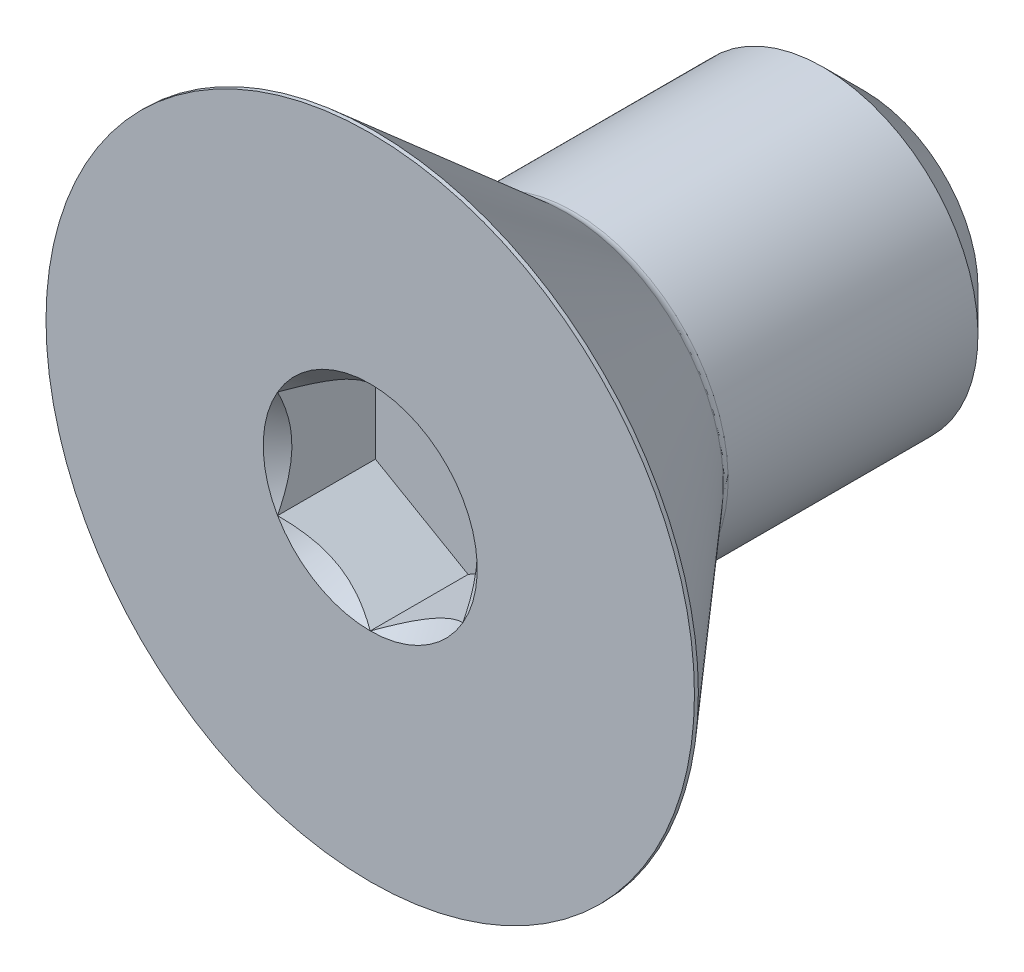
ISO-10303-21;
HEADER;
FILE_DESCRIPTION(('STEP AP214'),'2;1');
FILE_NAME('part.step','',(''),(''),'','','');
FILE_SCHEMA(('AUTOMOTIVE_DESIGN { 1 0 10303 214 1 1 1 1 }'));
ENDSEC;
DATA;
#1=APPLICATION_CONTEXT('core data for automotive mechanical design processes');
#2=APPLICATION_PROTOCOL_DEFINITION('international standard','automotive_design',2000,#1);
#3=PRODUCT_CONTEXT('',#1,'mechanical');
#4=PRODUCT('Part','Part','',(#3));
#5=PRODUCT_RELATED_PRODUCT_CATEGORY('part','',(#4));
#6=PRODUCT_DEFINITION_FORMATION('','',#4);
#7=PRODUCT_DEFINITION_CONTEXT('part definition',#1,'design');
#8=PRODUCT_DEFINITION('design','',#6,#7);
#9=PRODUCT_DEFINITION_SHAPE('','',#8);
#10=(LENGTH_UNIT() NAMED_UNIT(*) SI_UNIT(.MILLI.,.METRE.));
#11=(NAMED_UNIT(*) PLANE_ANGLE_UNIT() SI_UNIT($,.RADIAN.));
#12=(NAMED_UNIT(*) SI_UNIT($,.STERADIAN.) SOLID_ANGLE_UNIT());
#13=UNCERTAINTY_MEASURE_WITH_UNIT(LENGTH_MEASURE(1.E-05),#10,'distance_accuracy_value','');
#14=(GEOMETRIC_REPRESENTATION_CONTEXT(3) GLOBAL_UNCERTAINTY_ASSIGNED_CONTEXT((#13)) GLOBAL_UNIT_ASSIGNED_CONTEXT((#10,
#11,#12)) REPRESENTATION_CONTEXT('',''));
#15=CARTESIAN_POINT('',(0.,0.,0.));
#16=DIRECTION('',(0.,0.,1.));
#17=DIRECTION('',(1.,0.,0.));
#18=AXIS2_PLACEMENT_3D('',#15,#16,#17);
#19=CARTESIAN_POINT('',(0.,0.,6.35));
#20=DIRECTION('',(0.,0.,1.));
#21=DIRECTION('',(1.,0.,0.));
#22=AXIS2_PLACEMENT_3D('',#19,#20,#21);
#23=CONICAL_SURFACE('',#22,2.74963065701559,0.78539816339745);
#24=CARTESIAN_POINT('',(0.,0.,6.35));
#25=DIRECTION('',(0.,0.,1.));
#26=DIRECTION('',(1.,0.,0.));
#27=AXIS2_PLACEMENT_3D('',#24,#25,#26);
#28=CIRCLE('',#27,2.74963065701559);
#29=CARTESIAN_POINT('',(0.,-2.74963065701559,6.35));
#30=VERTEX_POINT('',#29);
#31=CARTESIAN_POINT('',(2.38125,-1.3748153285078,6.35));
#32=VERTEX_POINT('',#31);
#33=EDGE_CURVE('E261',#30,#32,#28,.T.);
#34=ORIENTED_EDGE('',*,*,#33,.T.);
#35=CARTESIAN_POINT('',(2.38145,-1.37469985845396,6.35011547732724));
#36=CARTESIAN_POINT('',(2.29959321762095,-1.4219598937955,6.30289489670953));
#37=CARTESIAN_POINT('',(2.21636766622824,-1.47001018829554,6.2584475752929));
#38=CARTESIAN_POINT('',(2.04666151916196,-1.56799007798739,6.17706545698558));
#39=CARTESIAN_POINT('',(1.9601647826469,-1.61792899209838,6.14017594309514));
#40=CARTESIAN_POINT('',(1.78574822599096,-1.71862843803482,6.07698341316591));
#41=CARTESIAN_POINT('',(1.69787282881933,-1.769363322247,6.05052155872948));
#42=CARTESIAN_POINT('',(1.52018740592913,-1.87195004898373,6.00975151561606));
#43=CARTESIAN_POINT('',(1.43038280881413,-1.92379875730254,5.99541289153055));
#44=CARTESIAN_POINT('',(1.27561039686966,-2.01315665100181,5.98247578477011));
#45=CARTESIAN_POINT('',(1.21084255103038,-2.05055038423195,5.98056060465318));
#46=CARTESIAN_POINT('',(1.08141272066443,-2.1252767316349,5.98378662276768));
#47=CARTESIAN_POINT('',(1.01675078120664,-2.16260931978717,5.98893029485709));
#48=CARTESIAN_POINT('',(0.888037451422604,-2.23692199538628,6.00598131087163));
#49=CARTESIAN_POINT('',(0.823986825765146,-2.27390164135138,6.01789622134933));
#50=CARTESIAN_POINT('',(0.696993161094727,-2.34722146783422,6.04783567235203));
#51=CARTESIAN_POINT('',(0.634050037564176,-2.38356169714822,6.06585974451845));
#52=CARTESIAN_POINT('',(0.472823849267819,-2.47664568036154,6.11936880755241));
#53=CARTESIAN_POINT('',(0.37554050871216,-2.53281224321902,6.15888742087218));
#54=CARTESIAN_POINT('',(0.23249393737443,-2.61540021968751,6.2256003435508));
#55=CARTESIAN_POINT('',(0.185353711056035,-2.64261664204209,6.24904020911133));
#56=CARTESIAN_POINT('',(0.0919464736333617,-2.69654533571233,6.29805667665953));
#57=CARTESIAN_POINT('',(0.0456789475031785,-2.72325790437833,6.32363196676685));
#58=CARTESIAN_POINT('',(-0.000200000000000133,-2.74974612706943,6.35011547732723));
#59=B_SPLINE_CURVE_WITH_KNOTS('',3,(#35,#36,#37,#38,#39,#40,#41,#42,#43,#44,#45,#46,#47,#48,#49,
#50,#51,#52,#53,#54,#55,#56,#57,#58),.UNSPECIFIED.,.F.,.F.,(4,2,2,2,2,2,2,2,2,2,2,4),(0.,
0.317196610611948,0.636241461041218,0.95021895062922,1.26340583824126,1.48752413747844,
1.71172100167747,1.93616888974082,2.16059957440836,2.51709639744763,2.69486147369099,
2.87251813383154),.UNSPECIFIED.);
#60=EDGE_CURVE('E11',#32,#30,#59,.T.);
#61=ORIENTED_EDGE('',*,*,#60,.T.);
#62=EDGE_LOOP('',(#34,#61));
#63=FACE_BOUND('',#62,.T.);
#64=ADVANCED_FACE('F43',(#63),#23,.F.);
#65=CARTESIAN_POINT('',(-2.38125,-1.3748153285078,6.35));
#66=VERTEX_POINT('',#65);
#67=EDGE_CURVE('E267',#66,#30,#28,.T.);
#68=ORIENTED_EDGE('',*,*,#67,.T.);
#69=CARTESIAN_POINT('',(0.000199999999999951,-2.74974612706943,6.35011547732723));
#70=CARTESIAN_POINT('',(-0.0816567823790501,-2.70248609172789,6.30289489670953));
#71=CARTESIAN_POINT('',(-0.16488233377176,-2.65443579722785,6.25844757529289));
#72=CARTESIAN_POINT('',(-0.334588480838039,-2.556455907536,6.17706545698558));
#73=CARTESIAN_POINT('',(-0.421085217353102,-2.50651699342501,6.14017594309514));
#74=CARTESIAN_POINT('',(-0.595501774009042,-2.40581754748857,6.07698341316591));
#75=CARTESIAN_POINT('',(-0.683377171180674,-2.35508266327639,6.05052155872948));
#76=CARTESIAN_POINT('',(-0.861062594070874,-2.25249593653966,6.00975151561606));
#77=CARTESIAN_POINT('',(-0.950867191185869,-2.20064722822085,5.99541289153055));
#78=CARTESIAN_POINT('',(-1.10563960313034,-2.11128933452158,5.98247578477011));
#79=CARTESIAN_POINT('',(-1.17040744896962,-2.07389560129144,5.98056060465318));
#80=CARTESIAN_POINT('',(-1.29983727933557,-1.99916925388849,5.98378662276768));
#81=CARTESIAN_POINT('',(-1.36449921879335,-1.96183666573622,5.98893029485709));
#82=CARTESIAN_POINT('',(-1.4932125485774,-1.88752399013711,6.00598131087163));
#83=CARTESIAN_POINT('',(-1.55726317423485,-1.85054434417201,6.01789622134933));
#84=CARTESIAN_POINT('',(-1.68425683890527,-1.77722451768917,6.04783567235203));
#85=CARTESIAN_POINT('',(-1.74719996243582,-1.74088428837517,6.06585974451845));
#86=CARTESIAN_POINT('',(-1.90842615073218,-1.64780030516185,6.11936880755241));
#87=CARTESIAN_POINT('',(-2.00570949128784,-1.59163374230437,6.15888742087218));
#88=CARTESIAN_POINT('',(-2.14875606262557,-1.50904576583588,6.2256003435508));
#89=CARTESIAN_POINT('',(-2.19589628894396,-1.4818293434813,6.24904020911133));
#90=CARTESIAN_POINT('',(-2.28930352636664,-1.42790064981106,6.29805667665953));
#91=CARTESIAN_POINT('',(-2.33557105249682,-1.40118808114506,6.32363196676685));
#92=CARTESIAN_POINT('',(-2.38145,-1.37469985845396,6.35011547732723));
#93=B_SPLINE_CURVE_WITH_KNOTS('',3,(#69,#70,#71,#72,#73,#74,#75,#76,#77,#78,#79,#80,#81,#82,#83,
#84,#85,#86,#87,#88,#89,#90,#91,#92),.UNSPECIFIED.,.F.,.F.,(4,2,2,2,2,2,2,2,2,2,2,4),(0.,
0.317196610611948,0.636241461041217,0.95021895062922,1.26340583824126,1.48752413747844,
1.71172100167747,1.93616888974082,2.16059957440836,2.51709639744763,2.69486147369099,
2.87251813383154),.UNSPECIFIED.);
#94=EDGE_CURVE('E58',#30,#66,#93,.T.);
#95=ORIENTED_EDGE('',*,*,#94,.T.);
#96=EDGE_LOOP('',(#68,#95));
#97=FACE_BOUND('',#96,.T.);
#98=ADVANCED_FACE('F252',(#97),#23,.F.);
#99=CARTESIAN_POINT('',(-2.38125,1.3748153285078,6.35));
#100=VERTEX_POINT('',#99);
#101=EDGE_CURVE('E270',#100,#66,#28,.T.);
#102=ORIENTED_EDGE('',*,*,#101,.T.);
#103=CARTESIAN_POINT('',(-2.38125,-2.76513009051435,7.24951937826219));
#104=CARTESIAN_POINT('',(-2.38125,-2.69790571233006,7.19859191015372));
#105=CARTESIAN_POINT('',(-2.38125,-2.63030755258223,7.14814985774846));
#106=CARTESIAN_POINT('',(-2.38125,-2.49421522920328,7.04845474857597));
#107=CARTESIAN_POINT('',(-2.38125,-2.42572084725744,6.99920199015269));
#108=CARTESIAN_POINT('',(-2.38125,-2.28718654894065,6.90175328204461));
#109=CARTESIAN_POINT('',(-2.38125,-2.21713877147426,6.85356847015126));
#110=CARTESIAN_POINT('',(-2.38125,-2.07585830538647,6.75897418595535));
#111=CARTESIAN_POINT('',(-2.38125,-2.00462570055812,6.71256458886602));
#112=CARTESIAN_POINT('',(-2.38125,-1.85658166369395,6.6192684283732));
#113=CARTESIAN_POINT('',(-2.38125,-1.77968748647159,6.57251250056159));
#114=CARTESIAN_POINT('',(-2.38125,-1.62412425656909,6.48205746342254));
#115=CARTESIAN_POINT('',(-2.38125,-1.54545543930987,6.43835795175306));
#116=CARTESIAN_POINT('',(-2.38125,-1.38631173941434,6.35493515988948));
#117=CARTESIAN_POINT('',(-2.38125,-1.30584274762155,6.31520072988093));
#118=CARTESIAN_POINT('',(-2.38125,-1.14269495313254,6.24060500691776));
#119=CARTESIAN_POINT('',(-2.38125,-1.06001717956803,6.20574149006481));
#120=CARTESIAN_POINT('',(-2.38125,-0.899356560556812,6.14480384313047));
#121=CARTESIAN_POINT('',(-2.38125,-0.821562349198679,6.11823751845382));
#122=CARTESIAN_POINT('',(-2.38125,-0.664080691049126,6.07134286567326));
#123=CARTESIAN_POINT('',(-2.38125,-0.584393116172313,6.0510149608983));
#124=CARTESIAN_POINT('',(-2.38125,-0.424937178285947,6.01800387335777));
#125=CARTESIAN_POINT('',(-2.38125,-0.34519668329201,6.00518828552928));
#126=CARTESIAN_POINT('',(-2.38125,-0.184837701993369,5.98745427017112));
#127=CARTESIAN_POINT('',(-2.38125,-0.104219374591418,5.98253443653616));
#128=CARTESIAN_POINT('',(-2.38125,0.0540719814400706,5.98096731734108));
#129=CARTESIAN_POINT('',(-2.38125,0.131742096445944,5.98401674808359));
#130=CARTESIAN_POINT('',(-2.38125,0.286427748987632,5.9975453260606));
#131=CARTESIAN_POINT('',(-2.38125,0.363443222914704,6.00802518711341));
#132=CARTESIAN_POINT('',(-2.38125,0.517567275875196,6.03601647853097));
#133=CARTESIAN_POINT('',(-2.38125,0.594653652191077,6.0536483802285));
#134=CARTESIAN_POINT('',(-2.38125,0.747136107407495,6.09499956168754));
#135=CARTESIAN_POINT('',(-2.38125,0.82253231913463,6.11871836125561));
#136=CARTESIAN_POINT('',(-2.38125,1.05887774757173,6.20201586762944));
#137=CARTESIAN_POINT('',(-2.38125,1.21651101030387,6.2710380659339));
#138=CARTESIAN_POINT('',(-2.38125,1.44718859635533,6.38609571601973));
#139=CARTESIAN_POINT('',(-2.38125,1.52326251892295,6.42645951435032));
#140=CARTESIAN_POINT('',(-2.38125,1.67368295226282,6.51029404233612));
#141=CARTESIAN_POINT('',(-2.38125,1.74802976963097,6.5537642148755));
#142=CARTESIAN_POINT('',(-2.38125,1.89154465453867,6.64096308922188));
#143=CARTESIAN_POINT('',(-2.38125,1.96078652710187,6.68457170052765));
#144=CARTESIAN_POINT('',(-2.38125,2.09808288210965,6.77362870170972));
#145=CARTESIAN_POINT('',(-2.38125,2.16613727423032,6.81907723067115));
#146=CARTESIAN_POINT('',(-2.38125,2.3006613881227,6.91110985879219));
#147=CARTESIAN_POINT('',(-2.38125,2.36713948266505,6.9576817702268));
#148=CARTESIAN_POINT('',(-2.38125,2.49918640707541,7.05206080023247));
#149=CARTESIAN_POINT('',(-2.38125,2.56475548211115,7.09986757538665));
#150=CARTESIAN_POINT('',(-2.38125,2.6299439576472,7.14817948205118));
#151=B_SPLINE_CURVE_WITH_KNOTS('',3,(#103,#104,#105,#106,#107,#108,#109,#110,#111,#112,#113,
#114,#115,#116,#117,#118,#119,#120,#121,#122,#123,#124,#125,#126,#127,#128,#129,#130,#131,#132,
#133,#134,#135,#136,#137,#138,#139,#140,#141,#142,#143,#144,#145,#146,#147,#148,#149,#150),
.UNSPECIFIED.,.F.,.F.,(4,2,2,2,2,2,2,2,2,2,2,2,2,2,2,2,2,2,2,2,2,2,2,4),(0.,0.253015838367238,
0.506094501908377,0.761133034369331,1.01615360610825,1.28607808973768,1.55596697377342,
1.82507417639254,2.09405810919589,2.34045811161415,2.58687483063727,2.82880660343935,
3.07069528734811,3.30351370688698,3.53635449559777,3.77329195262979,4.01021072348386,
4.52485297036446,4.78318907363552,5.04147896107788,5.28693938084091,5.5324183905004,
5.77590800675537,6.01933062225049),.UNSPECIFIED.);
#152=EDGE_CURVE('E225',#66,#100,#151,.T.);
#153=ORIENTED_EDGE('',*,*,#152,.T.);
#154=EDGE_LOOP('',(#102,#153));
#155=FACE_BOUND('',#154,.T.);
#156=ADVANCED_FACE('F257',(#155),#23,.F.);
#157=CARTESIAN_POINT('',(0.,2.74963065701559,6.35));
#158=VERTEX_POINT('',#157);
#159=EDGE_CURVE('E162',#158,#100,#28,.T.);
#160=ORIENTED_EDGE('',*,*,#159,.T.);
#161=CARTESIAN_POINT('',(-2.38145,1.37469985845396,6.35011547732724));
#162=CARTESIAN_POINT('',(-2.29959321762095,1.4219598937955,6.30289489670953));
#163=CARTESIAN_POINT('',(-2.21636766622824,1.47001018829554,6.2584475752929));
#164=CARTESIAN_POINT('',(-2.04666151916196,1.56799007798739,6.17706545698558));
#165=CARTESIAN_POINT('',(-1.9601647826469,1.61792899209838,6.14017594309514));
#166=CARTESIAN_POINT('',(-1.78574822599096,1.71862843803482,6.07698341316591));
#167=CARTESIAN_POINT('',(-1.69787282881933,1.769363322247,6.05052155872948));
#168=CARTESIAN_POINT('',(-1.52018740592913,1.87195004898373,6.00975151561606));
#169=CARTESIAN_POINT('',(-1.43038280881413,1.92379875730254,5.99541289153055));
#170=CARTESIAN_POINT('',(-1.27561039686966,2.01315665100181,5.98247578477011));
#171=CARTESIAN_POINT('',(-1.21084255103038,2.05055038423195,5.98056060465318));
#172=CARTESIAN_POINT('',(-1.08141272066443,2.1252767316349,5.98378662276768));
#173=CARTESIAN_POINT('',(-1.01675078120665,2.16260931978717,5.98893029485709));
#174=CARTESIAN_POINT('',(-0.888037451422605,2.23692199538628,6.00598131087163));
#175=CARTESIAN_POINT('',(-0.823986825765147,2.27390164135138,6.01789622134933));
#176=CARTESIAN_POINT('',(-0.696993161094728,2.34722146783422,6.04783567235203));
#177=CARTESIAN_POINT('',(-0.634050037564177,2.38356169714822,6.06585974451845));
#178=CARTESIAN_POINT('',(-0.472823849267819,2.47664568036154,6.11936880755241));
#179=CARTESIAN_POINT('',(-0.375540508712161,2.53281224321902,6.15888742087218));
#180=CARTESIAN_POINT('',(-0.23249393737443,2.61540021968751,6.2256003435508));
#181=CARTESIAN_POINT('',(-0.185353711056035,2.6426166420421,6.24904020911133));
#182=CARTESIAN_POINT('',(-0.0919464736333616,2.69654533571234,6.29805667665953));
#183=CARTESIAN_POINT('',(-0.0456789475031781,2.72325790437834,6.32363196676685));
#184=CARTESIAN_POINT('',(0.000200000000000767,2.74974612706943,6.35011547732724));
#185=B_SPLINE_CURVE_WITH_KNOTS('',3,(#161,#162,#163,#164,#165,#166,#167,#168,#169,#170,#171,
#172,#173,#174,#175,#176,#177,#178,#179,#180,#181,#182,#183,#184),.UNSPECIFIED.,.F.,.F.,(4,2,2,
2,2,2,2,2,2,2,2,4),(0.,0.317196610611948,0.636241461041218,0.950218950629221,1.26340583824126,
1.48752413747844,1.71172100167747,1.93616888974082,2.16059957440836,2.51709639744763,
2.69486147369099,2.87251813383154),.UNSPECIFIED.);
#186=EDGE_CURVE('E115',#100,#158,#185,.T.);
#187=ORIENTED_EDGE('',*,*,#186,.T.);
#188=EDGE_LOOP('',(#160,#187));
#189=FACE_BOUND('',#188,.T.);
#190=ADVANCED_FACE('F287',(#189),#23,.F.);
#191=CARTESIAN_POINT('',(2.38125,1.3748153285078,6.35));
#192=VERTEX_POINT('',#191);
#193=EDGE_CURVE('E157',#192,#158,#28,.T.);
#194=ORIENTED_EDGE('',*,*,#193,.T.);
#195=CARTESIAN_POINT('',(-0.000199999999999496,2.74974612706943,6.35011547732724));
#196=CARTESIAN_POINT('',(0.0816567823790507,2.70248609172789,6.30289489670954));
#197=CARTESIAN_POINT('',(0.16488233377176,2.65443579722785,6.2584475752929));
#198=CARTESIAN_POINT('',(0.33458848083804,2.556455907536,6.17706545698558));
#199=CARTESIAN_POINT('',(0.421085217353102,2.50651699342501,6.14017594309514));
#200=CARTESIAN_POINT('',(0.595501774009042,2.40581754748857,6.07698341316591));
#201=CARTESIAN_POINT('',(0.683377171180674,2.35508266327639,6.05052155872948));
#202=CARTESIAN_POINT('',(0.861062594070875,2.25249593653966,6.00975151561606));
#203=CARTESIAN_POINT('',(0.95086719118587,2.20064722822085,5.99541289153055));
#204=CARTESIAN_POINT('',(1.10563960313034,2.11128933452158,5.98247578477011));
#205=CARTESIAN_POINT('',(1.17040744896962,2.07389560129144,5.98056060465318));
#206=CARTESIAN_POINT('',(1.29983727933557,1.99916925388849,5.98378662276768));
#207=CARTESIAN_POINT('',(1.36449921879335,1.96183666573622,5.98893029485709));
#208=CARTESIAN_POINT('',(1.4932125485774,1.88752399013711,6.00598131087164));
#209=CARTESIAN_POINT('',(1.55726317423485,1.85054434417201,6.01789622134933));
#210=CARTESIAN_POINT('',(1.68425683890527,1.77722451768917,6.04783567235203));
#211=CARTESIAN_POINT('',(1.74719996243582,1.74088428837517,6.06585974451845));
#212=CARTESIAN_POINT('',(1.90842615073218,1.64780030516185,6.11936880755241));
#213=CARTESIAN_POINT('',(2.00570949128784,1.59163374230437,6.15888742087218));
#214=CARTESIAN_POINT('',(2.14875606262557,1.50904576583588,6.2256003435508));
#215=CARTESIAN_POINT('',(2.19589628894396,1.4818293434813,6.24904020911133));
#216=CARTESIAN_POINT('',(2.28930352636664,1.42790064981106,6.29805667665953));
#217=CARTESIAN_POINT('',(2.33557105249682,1.40118808114506,6.32363196676685));
#218=CARTESIAN_POINT('',(2.38145,1.37469985845396,6.35011547732724));
#219=B_SPLINE_CURVE_WITH_KNOTS('',3,(#195,#196,#197,#198,#199,#200,#201,#202,#203,#204,#205,
#206,#207,#208,#209,#210,#211,#212,#213,#214,#215,#216,#217,#218),.UNSPECIFIED.,.F.,.F.,(4,2,2,
2,2,2,2,2,2,2,2,4),(0.,0.317196610611948,0.636241461041218,0.950218950629221,1.26340583824126,
1.48752413747844,1.71172100167747,1.93616888974082,2.16059957440836,2.51709639744763,
2.69486147369099,2.87251813383154),.UNSPECIFIED.);
#220=EDGE_CURVE('E195',#158,#192,#219,.T.);
#221=ORIENTED_EDGE('',*,*,#220,.T.);
#222=EDGE_LOOP('',(#194,#221));
#223=FACE_BOUND('',#222,.T.);
#224=ADVANCED_FACE('F212',(#223),#23,.F.);
#225=CARTESIAN_POINT('',(0.,0.,-6.35));
#226=DIRECTION('',(0.,0.,-1.));
#227=DIRECTION('',(0.,1.,0.));
#228=AXIS2_PLACEMENT_3D('',#225,#226,#227);
#229=CYLINDRICAL_SURFACE('',#228,8.3312);
#230=CARTESIAN_POINT('',(0.,0.,6.35));
#231=DIRECTION('',(0.,0.,-1.));
#232=DIRECTION('',(0.,1.,0.));
#233=AXIS2_PLACEMENT_3D('',#230,#231,#232);
#234=CIRCLE('',#233,8.3312);
#235=CARTESIAN_POINT('',(0.,8.3312,6.35));
#236=VERTEX_POINT('',#235);
#237=EDGE_CURVE('E182',#236,#236,#234,.T.);
#238=ORIENTED_EDGE('',*,*,#237,.T.);
#239=EDGE_LOOP('',(#238));
#240=FACE_BOUND('',#239,.T.);
#241=CARTESIAN_POINT('',(0.,0.,6.249416));
#242=DIRECTION('',(0.,0.,-1.));
#243=DIRECTION('',(0.,1.,0.));
#244=AXIS2_PLACEMENT_3D('',#241,#242,#243);
#245=CIRCLE('',#244,8.3312);
#246=CARTESIAN_POINT('',(0.,8.3312,6.249416));
#247=VERTEX_POINT('',#246);
#248=EDGE_CURVE('E161',#247,#247,#245,.T.);
#249=ORIENTED_EDGE('',*,*,#248,.F.);
#250=EDGE_LOOP('',(#249));
#251=FACE_BOUND('',#250,.T.);
#252=ADVANCED_FACE('F45',(#240,#251),#229,.T.);
#253=CARTESIAN_POINT('',(0.,0.,6.35));
#254=DIRECTION('',(0.,0.,1.));
#255=DIRECTION('',(0.,-1.,0.));
#256=AXIS2_PLACEMENT_3D('',#253,#254,#255);
#257=PLANE('',#256);
#258=ORIENTED_EDGE('',*,*,#193,.F.);
#259=EDGE_CURVE('E146',#32,#192,#28,.T.);
#260=ORIENTED_EDGE('',*,*,#259,.F.);
#261=ORIENTED_EDGE('',*,*,#33,.F.);
#262=ORIENTED_EDGE('',*,*,#67,.F.);
#263=ORIENTED_EDGE('',*,*,#101,.F.);
#264=ORIENTED_EDGE('',*,*,#159,.F.);
#265=EDGE_LOOP('',(#258,#260,#261,#262,#263,#264));
#266=FACE_BOUND('',#265,.T.);
#267=ORIENTED_EDGE('',*,*,#237,.F.);
#268=EDGE_LOOP('',(#267));
#269=FACE_BOUND('',#268,.T.);
#270=ADVANCED_FACE('F274',(#266,#269),#257,.T.);
#271=CARTESIAN_POINT('',(0.,2.91676666665819,-6.35));
#272=DIRECTION('',(0.,0.,-1.));
#273=DIRECTION('',(0.,1.,0.));
#274=AXIS2_PLACEMENT_3D('',#271,#272,#273);
#275=PLANE('',#274);
#276=CARTESIAN_POINT('',(0.,0.,-6.35));
#277=DIRECTION('',(0.,0.,-1.));
#278=DIRECTION('',(0.,1.,0.));
#279=AXIS2_PLACEMENT_3D('',#276,#277,#278);
#280=CIRCLE('',#279,2.91676666665819);
#281=CARTESIAN_POINT('',(0.,2.91676666665819,-6.35));
#282=VERTEX_POINT('',#281);
#283=EDGE_CURVE('E178',#282,#282,#280,.T.);
#284=ORIENTED_EDGE('',*,*,#283,.T.);
#285=EDGE_LOOP('',(#284));
#286=FACE_BOUND('',#285,.T.);
#287=ADVANCED_FACE('F348',(#286),#275,.T.);
#288=CARTESIAN_POINT('',(0.,0.,-6.35));
#289=DIRECTION('',(0.,0.,1.));
#290=DIRECTION('',(0.,-1.,0.));
#291=AXIS2_PLACEMENT_3D('',#288,#289,#290);
#292=CONICAL_SURFACE('',#291,2.91676666665819,0.785398163397454);
#293=CARTESIAN_POINT('',(0.,0.,-5.2916666666582));
#294=DIRECTION('',(0.,0.,-1.));
#295=DIRECTION('',(0.,1.,0.));
#296=AXIS2_PLACEMENT_3D('',#293,#294,#295);
#297=CIRCLE('',#296,3.9751);
#298=CARTESIAN_POINT('',(0.,3.9751,-5.2916666666582));
#299=VERTEX_POINT('',#298);
#300=EDGE_CURVE('E174',#299,#299,#297,.T.);
#301=ORIENTED_EDGE('',*,*,#300,.T.);
#302=EDGE_LOOP('',(#301));
#303=FACE_BOUND('',#302,.T.);
#304=ORIENTED_EDGE('',*,*,#283,.F.);
#305=EDGE_LOOP('',(#304));
#306=FACE_BOUND('',#305,.T.);
#307=ADVANCED_FACE('F337',(#303,#306),#292,.T.);
#308=CARTESIAN_POINT('',(0.,0.,-6.35));
#309=DIRECTION('',(0.,0.,-1.));
#310=DIRECTION('',(0.,1.,0.));
#311=AXIS2_PLACEMENT_3D('',#308,#309,#310);
#312=CYLINDRICAL_SURFACE('',#311,3.9751);
#313=CARTESIAN_POINT('',(0.,0.,1.12897754953225));
#314=DIRECTION('',(0.,0.,-1.));
#315=DIRECTION('',(0.,1.,0.));
#316=AXIS2_PLACEMENT_3D('',#313,#314,#315);
#317=CIRCLE('',#316,3.9751);
#318=CARTESIAN_POINT('',(0.,3.9751,1.12897754953225));
#319=VERTEX_POINT('',#318);
#320=EDGE_CURVE('E170',#319,#319,#317,.T.);
#321=ORIENTED_EDGE('',*,*,#320,.T.);
#322=EDGE_LOOP('',(#321));
#323=FACE_BOUND('',#322,.T.);
#324=ORIENTED_EDGE('',*,*,#300,.F.);
#325=EDGE_LOOP('',(#324));
#326=FACE_BOUND('',#325,.T.);
#327=ADVANCED_FACE('F327',(#323,#326),#312,.T.);
#328=CARTESIAN_POINT('',(0.,0.,1.12897754953225));
#329=DIRECTION('',(0.,0.,-1.));
#330=DIRECTION('',(0.,1.,0.));
#331=AXIS2_PLACEMENT_3D('',#328,#329,#330);
#332=TOROIDAL_SURFACE('',#331,4.26748596222494,0.292385962224941);
#333=CARTESIAN_POINT('',(0.,0.,1.3208));
#334=DIRECTION('',(0.,0.,-1.));
#335=DIRECTION('',(0.,1.,0.));
#336=AXIS2_PLACEMENT_3D('',#333,#334,#335);
#337=CIRCLE('',#336,4.04681947541113);
#338=CARTESIAN_POINT('',(0.,4.04681947541112,1.3208));
#339=VERTEX_POINT('',#338);
#340=EDGE_CURVE('E166',#339,#339,#337,.T.);
#341=ORIENTED_EDGE('',*,*,#340,.T.);
#342=EDGE_LOOP('',(#341));
#343=FACE_BOUND('',#342,.T.);
#344=ORIENTED_EDGE('',*,*,#320,.F.);
#345=EDGE_LOOP('',(#344));
#346=FACE_BOUND('',#345,.T.);
#347=ADVANCED_FACE('F316',(#343,#346),#332,.F.);
#348=CARTESIAN_POINT('',(0.,0.,1.3208));
#349=DIRECTION('',(0.,0.,1.));
#350=DIRECTION('',(0.,-1.,0.));
#351=AXIS2_PLACEMENT_3D('',#348,#349,#350);
#352=CONICAL_SURFACE('',#351,4.04681947541113,0.715584993317677);
#353=ORIENTED_EDGE('',*,*,#248,.T.);
#354=EDGE_LOOP('',(#353));
#355=FACE_BOUND('',#354,.T.);
#356=ORIENTED_EDGE('',*,*,#340,.F.);
#357=EDGE_LOOP('',(#356));
#358=FACE_BOUND('',#357,.T.);
#359=ADVANCED_FACE('F210',(#355,#358),#352,.T.);
#360=ORIENTED_EDGE('',*,*,#259,.T.);
#361=CARTESIAN_POINT('',(2.38125,-2.76513009051435,7.24951937826219));
#362=CARTESIAN_POINT('',(2.38125,-2.69790571233007,7.19859191015372));
#363=CARTESIAN_POINT('',(2.38125,-2.63030755258223,7.14814985774846));
#364=CARTESIAN_POINT('',(2.38125,-2.49421522920328,7.04845474857597));
#365=CARTESIAN_POINT('',(2.38125,-2.42572084725744,6.99920199015269));
#366=CARTESIAN_POINT('',(2.38125,-2.28718654894065,6.90175328204461));
#367=CARTESIAN_POINT('',(2.38125,-2.21713877147427,6.85356847015126));
#368=CARTESIAN_POINT('',(2.38125,-2.07585830538647,6.75897418595535));
#369=CARTESIAN_POINT('',(2.38125,-2.00462570055812,6.71256458886602));
#370=CARTESIAN_POINT('',(2.38125,-1.85658166369395,6.6192684283732));
#371=CARTESIAN_POINT('',(2.38125,-1.77968748647159,6.57251250056159));
#372=CARTESIAN_POINT('',(2.38125,-1.62412425656909,6.48205746342254));
#373=CARTESIAN_POINT('',(2.38125,-1.54545543930987,6.43835795175306));
#374=CARTESIAN_POINT('',(2.38125,-1.38631173941434,6.35493515988948));
#375=CARTESIAN_POINT('',(2.38125,-1.30584274762155,6.31520072988093));
#376=CARTESIAN_POINT('',(2.38125,-1.14269495313254,6.24060500691776));
#377=CARTESIAN_POINT('',(2.38125,-1.06001717956803,6.20574149006481));
#378=CARTESIAN_POINT('',(2.38125,-0.899356560556813,6.14480384313047));
#379=CARTESIAN_POINT('',(2.38125,-0.821562349198679,6.11823751845382));
#380=CARTESIAN_POINT('',(2.38125,-0.664080691049126,6.07134286567326));
#381=CARTESIAN_POINT('',(2.38125,-0.584393116172313,6.0510149608983));
#382=CARTESIAN_POINT('',(2.38125,-0.424937178285948,6.01800387335777));
#383=CARTESIAN_POINT('',(2.38125,-0.345196683292011,6.00518828552928));
#384=CARTESIAN_POINT('',(2.38125,-0.184837701993369,5.98745427017112));
#385=CARTESIAN_POINT('',(2.38125,-0.104219374591419,5.98253443653616));
#386=CARTESIAN_POINT('',(2.38125,0.0540719814400702,5.98096731734108));
#387=CARTESIAN_POINT('',(2.38125,0.131742096445944,5.98401674808359));
#388=CARTESIAN_POINT('',(2.38125,0.286427748987632,5.9975453260606));
#389=CARTESIAN_POINT('',(2.38125,0.363443222914704,6.00802518711341));
#390=CARTESIAN_POINT('',(2.38125,0.517567275875196,6.03601647853097));
#391=CARTESIAN_POINT('',(2.38125,0.594653652191077,6.0536483802285));
#392=CARTESIAN_POINT('',(2.38125,0.747136107407494,6.09499956168754));
#393=CARTESIAN_POINT('',(2.38125,0.82253231913463,6.11871836125561));
#394=CARTESIAN_POINT('',(2.38125,1.05887774757173,6.20201586762944));
#395=CARTESIAN_POINT('',(2.38125,1.21651101030387,6.2710380659339));
#396=CARTESIAN_POINT('',(2.38125,1.44718859635533,6.38609571601973));
#397=CARTESIAN_POINT('',(2.38125,1.52326251892295,6.42645951435032));
#398=CARTESIAN_POINT('',(2.38125,1.67368295226282,6.51029404233612));
#399=CARTESIAN_POINT('',(2.38125,1.74802976963097,6.5537642148755));
#400=CARTESIAN_POINT('',(2.38125,1.89154465453867,6.64096308922188));
#401=CARTESIAN_POINT('',(2.38125,1.96078652710186,6.68457170052765));
#402=CARTESIAN_POINT('',(2.38125,2.09808288210965,6.77362870170972));
#403=CARTESIAN_POINT('',(2.38125,2.16613727423032,6.81907723067115));
#404=CARTESIAN_POINT('',(2.38125,2.3006613881227,6.91110985879219));
#405=CARTESIAN_POINT('',(2.38125,2.36713948266505,6.9576817702268));
#406=CARTESIAN_POINT('',(2.38125,2.49918640707541,7.05206080023247));
#407=CARTESIAN_POINT('',(2.38125,2.56475548211115,7.09986757538665));
#408=CARTESIAN_POINT('',(2.38125,2.6299439576472,7.14817948205118));
#409=B_SPLINE_CURVE_WITH_KNOTS('',3,(#361,#362,#363,#364,#365,#366,#367,#368,#369,#370,#371,
#372,#373,#374,#375,#376,#377,#378,#379,#380,#381,#382,#383,#384,#385,#386,#387,#388,#389,#390,
#391,#392,#393,#394,#395,#396,#397,#398,#399,#400,#401,#402,#403,#404,#405,#406,#407,#408),
.UNSPECIFIED.,.F.,.F.,(4,2,2,2,2,2,2,2,2,2,2,2,2,2,2,2,2,2,2,2,2,2,2,4),(0.,0.253015838367239,
0.506094501908377,0.761133034369332,1.01615360610825,1.28607808973768,1.55596697377342,
1.82507417639254,2.09405810919589,2.34045811161415,2.58687483063728,2.82880660343935,
3.07069528734811,3.30351370688698,3.53635449559777,3.77329195262979,4.01021072348386,
4.52485297036446,4.78318907363552,5.04147896107788,5.28693938084092,5.5324183905004,
5.77590800675537,6.01933062225049),.UNSPECIFIED.);
#410=EDGE_CURVE('E186',#192,#32,#409,.F.);
#411=ORIENTED_EDGE('',*,*,#410,.T.);
#412=EDGE_LOOP('',(#360,#411));
#413=FACE_BOUND('',#412,.T.);
#414=ADVANCED_FACE('F204',(#413),#23,.F.);
#415=CARTESIAN_POINT('',(0.,-2.74963065701559,3.8354));
#416=DIRECTION('',(0.5,-0.866025403784439,0.));
#417=DIRECTION('',(0.866025403784439,0.5,0.));
#418=AXIS2_PLACEMENT_3D('',#415,#416,#417);
#419=PLANE('',#418);
#420=DIRECTION('',(0.,0.,1.));
#421=VECTOR('',#420,1.);
#422=CARTESIAN_POINT('',(2.38125,-1.3748153285078,3.8354));
#423=LINE('',#422,#421);
#424=CARTESIAN_POINT('',(2.38125,-1.3748153285078,3.8354));
#425=VERTEX_POINT('',#424);
#426=EDGE_CURVE('E65',#425,#32,#423,.T.);
#427=ORIENTED_EDGE('',*,*,#426,.F.);
#428=DIRECTION('',(0.866025403784439,0.5,0.));
#429=VECTOR('',#428,1.);
#430=CARTESIAN_POINT('',(0.,-2.74963065701559,3.8354));
#431=LINE('',#430,#429);
#432=CARTESIAN_POINT('',(0.,-2.74963065701559,3.8354));
#433=VERTEX_POINT('',#432);
#434=EDGE_CURVE('E485',#433,#425,#431,.T.);
#435=ORIENTED_EDGE('',*,*,#434,.F.);
#436=DIRECTION('',(0.,0.,1.));
#437=VECTOR('',#436,1.);
#438=CARTESIAN_POINT('',(0.,-2.74963065701559,3.8354));
#439=LINE('',#438,#437);
#440=EDGE_CURVE('E74',#433,#30,#439,.T.);
#441=ORIENTED_EDGE('',*,*,#440,.T.);
#442=ORIENTED_EDGE('',*,*,#60,.F.);
#443=EDGE_LOOP('',(#427,#435,#441,#442));
#444=FACE_BOUND('',#443,.T.);
#445=ADVANCED_FACE('F209',(#444),#419,.F.);
#446=CARTESIAN_POINT('',(-2.38125,-1.3748153285078,3.8354));
#447=DIRECTION('',(-0.5,-0.866025403784439,0.));
#448=DIRECTION('',(0.866025403784439,-0.5,0.));
#449=AXIS2_PLACEMENT_3D('',#446,#447,#448);
#450=PLANE('',#449);
#451=ORIENTED_EDGE('',*,*,#440,.F.);
#452=DIRECTION('',(0.866025403784439,-0.5,0.));
#453=VECTOR('',#452,1.);
#454=CARTESIAN_POINT('',(-2.38125,-1.3748153285078,3.8354));
#455=LINE('',#454,#453);
#456=CARTESIAN_POINT('',(-2.38125,-1.3748153285078,3.8354));
#457=VERTEX_POINT('',#456);
#458=EDGE_CURVE('E128',#457,#433,#455,.T.);
#459=ORIENTED_EDGE('',*,*,#458,.F.);
#460=DIRECTION('',(0.,0.,1.));
#461=VECTOR('',#460,1.);
#462=CARTESIAN_POINT('',(-2.38125,-1.3748153285078,3.8354));
#463=LINE('',#462,#461);
#464=EDGE_CURVE('E119',#457,#66,#463,.T.);
#465=ORIENTED_EDGE('',*,*,#464,.T.);
#466=ORIENTED_EDGE('',*,*,#94,.F.);
#467=EDGE_LOOP('',(#451,#459,#465,#466));
#468=FACE_BOUND('',#467,.T.);
#469=ADVANCED_FACE('F237',(#468),#450,.F.);
#470=CARTESIAN_POINT('',(-2.38125,1.3748153285078,3.8354));
#471=DIRECTION('',(-1.,0.,0.));
#472=DIRECTION('',(0.,0.,1.));
#473=AXIS2_PLACEMENT_3D('',#470,#471,#472);
#474=PLANE('',#473);
#475=ORIENTED_EDGE('',*,*,#464,.F.);
#476=DIRECTION('',(0.,-1.,0.));
#477=VECTOR('',#476,1.);
#478=CARTESIAN_POINT('',(-2.38125,1.3748153285078,3.8354));
#479=LINE('',#478,#477);
#480=CARTESIAN_POINT('',(-2.38125,1.3748153285078,3.8354));
#481=VERTEX_POINT('',#480);
#482=EDGE_CURVE('E123',#481,#457,#479,.T.);
#483=ORIENTED_EDGE('',*,*,#482,.F.);
#484=DIRECTION('',(0.,0.,1.));
#485=VECTOR('',#484,1.);
#486=CARTESIAN_POINT('',(-2.38125,1.3748153285078,3.8354));
#487=LINE('',#486,#485);
#488=EDGE_CURVE('E107',#481,#100,#487,.T.);
#489=ORIENTED_EDGE('',*,*,#488,.T.);
#490=ORIENTED_EDGE('',*,*,#152,.F.);
#491=EDGE_LOOP('',(#475,#483,#489,#490));
#492=FACE_BOUND('',#491,.T.);
#493=ADVANCED_FACE('F124',(#492),#474,.F.);
#494=CARTESIAN_POINT('',(0.,2.74963065701559,3.8354));
#495=DIRECTION('',(-0.5,0.866025403784439,0.));
#496=DIRECTION('',(-0.866025403784439,-0.5,0.));
#497=AXIS2_PLACEMENT_3D('',#494,#495,#496);
#498=PLANE('',#497);
#499=ORIENTED_EDGE('',*,*,#488,.F.);
#500=DIRECTION('',(-0.866025403784439,-0.5,0.));
#501=VECTOR('',#500,1.);
#502=CARTESIAN_POINT('',(0.,2.74963065701559,3.8354));
#503=LINE('',#502,#501);
#504=CARTESIAN_POINT('',(0.,2.74963065701559,3.8354));
#505=VERTEX_POINT('',#504);
#506=EDGE_CURVE('E112',#505,#481,#503,.T.);
#507=ORIENTED_EDGE('',*,*,#506,.F.);
#508=DIRECTION('',(0.,0.,1.));
#509=VECTOR('',#508,1.);
#510=CARTESIAN_POINT('',(0.,2.74963065701559,3.8354));
#511=LINE('',#510,#509);
#512=EDGE_CURVE('E120',#505,#158,#511,.T.);
#513=ORIENTED_EDGE('',*,*,#512,.T.);
#514=ORIENTED_EDGE('',*,*,#186,.F.);
#515=EDGE_LOOP('',(#499,#507,#513,#514));
#516=FACE_BOUND('',#515,.T.);
#517=ADVANCED_FACE('F109',(#516),#498,.F.);
#518=CARTESIAN_POINT('',(2.38125,1.3748153285078,3.8354));
#519=DIRECTION('',(0.5,0.866025403784438,0.));
#520=DIRECTION('',(-0.866025403784439,0.5,0.));
#521=AXIS2_PLACEMENT_3D('',#518,#519,#520);
#522=PLANE('',#521);
#523=ORIENTED_EDGE('',*,*,#512,.F.);
#524=DIRECTION('',(-0.866025403784438,0.5,0.));
#525=VECTOR('',#524,1.);
#526=CARTESIAN_POINT('',(2.38125,1.3748153285078,3.8354));
#527=LINE('',#526,#525);
#528=CARTESIAN_POINT('',(2.38125,1.3748153285078,3.8354));
#529=VERTEX_POINT('',#528);
#530=EDGE_CURVE('E134',#529,#505,#527,.T.);
#531=ORIENTED_EDGE('',*,*,#530,.F.);
#532=DIRECTION('',(0.,0.,1.));
#533=VECTOR('',#532,1.);
#534=CARTESIAN_POINT('',(2.38125,1.3748153285078,3.8354));
#535=LINE('',#534,#533);
#536=EDGE_CURVE('E151',#529,#192,#535,.T.);
#537=ORIENTED_EDGE('',*,*,#536,.T.);
#538=ORIENTED_EDGE('',*,*,#220,.F.);
#539=EDGE_LOOP('',(#523,#531,#537,#538));
#540=FACE_BOUND('',#539,.T.);
#541=ADVANCED_FACE('F244',(#540),#522,.F.);
#542=CARTESIAN_POINT('',(2.38125,-1.3748153285078,3.8354));
#543=DIRECTION('',(1.,0.,0.));
#544=DIRECTION('',(0.,0.,-1.));
#545=AXIS2_PLACEMENT_3D('',#542,#543,#544);
#546=PLANE('',#545);
#547=ORIENTED_EDGE('',*,*,#536,.F.);
#548=DIRECTION('',(0.,1.,0.));
#549=VECTOR('',#548,1.);
#550=CARTESIAN_POINT('',(2.38125,-1.3748153285078,3.8354));
#551=LINE('',#550,#549);
#552=EDGE_CURVE('E138',#425,#529,#551,.T.);
#553=ORIENTED_EDGE('',*,*,#552,.F.);
#554=ORIENTED_EDGE('',*,*,#426,.T.);
#555=ORIENTED_EDGE('',*,*,#410,.F.);
#556=EDGE_LOOP('',(#547,#553,#554,#555));
#557=FACE_BOUND('',#556,.T.);
#558=ADVANCED_FACE('F202',(#557),#546,.F.);
#559=CARTESIAN_POINT('',(0.,0.,3.8354));
#560=DIRECTION('',(0.,0.,1.));
#561=DIRECTION('',(1.,0.,0.));
#562=AXIS2_PLACEMENT_3D('',#559,#560,#561);
#563=PLANE('',#562);
#564=ORIENTED_EDGE('',*,*,#434,.T.);
#565=ORIENTED_EDGE('',*,*,#552,.T.);
#566=ORIENTED_EDGE('',*,*,#530,.T.);
#567=ORIENTED_EDGE('',*,*,#506,.T.);
#568=ORIENTED_EDGE('',*,*,#482,.T.);
#569=ORIENTED_EDGE('',*,*,#458,.T.);
#570=EDGE_LOOP('',(#564,#565,#566,#567,#568,#569));
#571=FACE_BOUND('',#570,.T.);
#572=ADVANCED_FACE('F131',(#571),#563,.T.);
#573=CLOSED_SHELL('',(#64,#98,#156,#190,#224,#252,#270,#287,#307,#327,#347,#359,#414,#445,#469,
#493,#517,#541,#558,#572));
#574=MANIFOLD_SOLID_BREP('B2',#573);
#575=ADVANCED_BREP_SHAPE_REPRESENTATION('',(#18,#574),#14);
#576=SHAPE_DEFINITION_REPRESENTATION(#9,#575);
ENDSEC;
END-ISO-10303-21;
